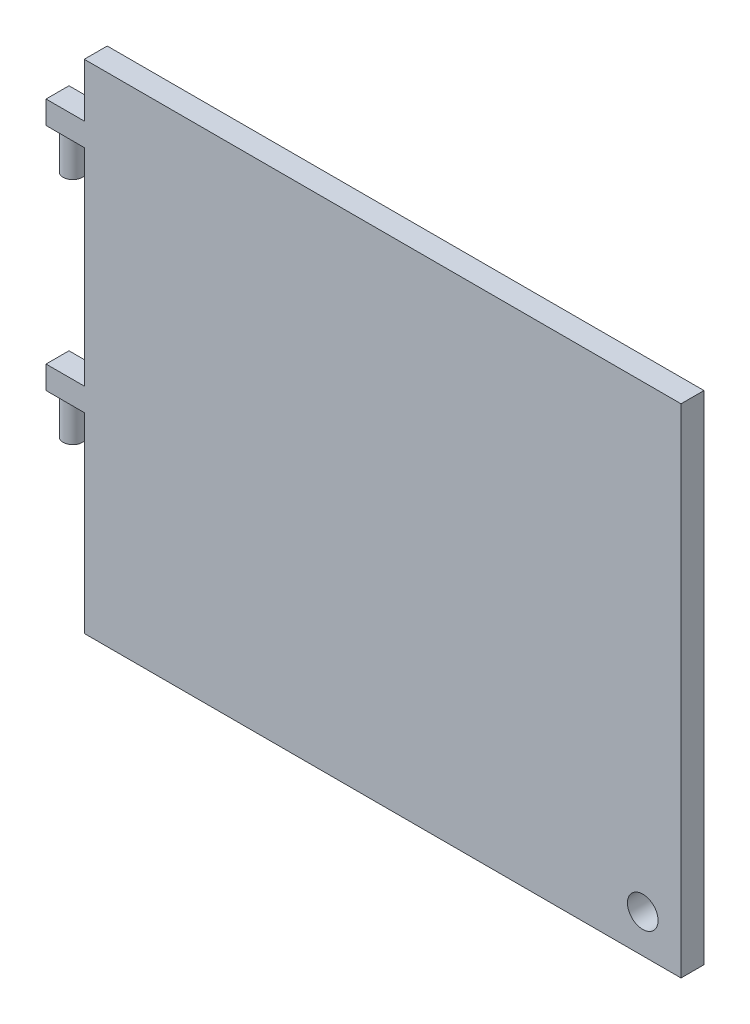
ISO-10303-21;
HEADER;
FILE_DESCRIPTION(('STEP AP214'),'2;1');
FILE_NAME('part.step','',(''),(''),'','','');
FILE_SCHEMA(('AUTOMOTIVE_DESIGN { 1 0 10303 214 1 1 1 1 }'));
ENDSEC;
DATA;
#1=APPLICATION_CONTEXT('core data for automotive mechanical design processes');
#2=APPLICATION_PROTOCOL_DEFINITION('international standard','automotive_design',2000,#1);
#3=PRODUCT_CONTEXT('',#1,'mechanical');
#4=PRODUCT('Part','Part','',(#3));
#5=PRODUCT_RELATED_PRODUCT_CATEGORY('part','',(#4));
#6=PRODUCT_DEFINITION_FORMATION('','',#4);
#7=PRODUCT_DEFINITION_CONTEXT('part definition',#1,'design');
#8=PRODUCT_DEFINITION('design','',#6,#7);
#9=PRODUCT_DEFINITION_SHAPE('','',#8);
#10=(LENGTH_UNIT() NAMED_UNIT(*) SI_UNIT(.MILLI.,.METRE.));
#11=(NAMED_UNIT(*) PLANE_ANGLE_UNIT() SI_UNIT($,.RADIAN.));
#12=(NAMED_UNIT(*) SI_UNIT($,.STERADIAN.) SOLID_ANGLE_UNIT());
#13=UNCERTAINTY_MEASURE_WITH_UNIT(LENGTH_MEASURE(1.E-05),#10,'distance_accuracy_value','');
#14=(GEOMETRIC_REPRESENTATION_CONTEXT(3) GLOBAL_UNCERTAINTY_ASSIGNED_CONTEXT((#13)) GLOBAL_UNIT_ASSIGNED_CONTEXT((#10,
#11,#12)) REPRESENTATION_CONTEXT('',''));
#15=CARTESIAN_POINT('',(0.,0.,0.));
#16=DIRECTION('',(0.,0.,1.));
#17=DIRECTION('',(1.,0.,0.));
#18=AXIS2_PLACEMENT_3D('',#15,#16,#17);
#19=CARTESIAN_POINT('',(0.,0.,3.));
#20=DIRECTION('',(1.,0.,0.));
#21=DIRECTION('',(0.,0.,-1.));
#22=AXIS2_PLACEMENT_3D('',#19,#20,#21);
#23=PLANE('',#22);
#24=DIRECTION('',(0.,0.,1.));
#25=VECTOR('',#24,1.);
#26=CARTESIAN_POINT('',(0.,25.,3.));
#27=LINE('',#26,#25);
#28=CARTESIAN_POINT('',(0.,25.,0.));
#29=VERTEX_POINT('',#28);
#30=CARTESIAN_POINT('',(0.,25.,3.));
#31=VERTEX_POINT('',#30);
#32=EDGE_CURVE('E144',#29,#31,#27,.T.);
#33=ORIENTED_EDGE('',*,*,#32,.F.);
#34=DIRECTION('',(0.,-1.,0.));
#35=VECTOR('',#34,1.);
#36=CARTESIAN_POINT('',(0.,0.,0.));
#37=LINE('',#36,#35);
#38=CARTESIAN_POINT('',(0.,0.,0.));
#39=VERTEX_POINT('',#38);
#40=EDGE_CURVE('E132',#29,#39,#37,.T.);
#41=ORIENTED_EDGE('',*,*,#40,.T.);
#42=DIRECTION('',(0.,0.,-1.));
#43=VECTOR('',#42,1.);
#44=CARTESIAN_POINT('',(0.,0.,3.));
#45=LINE('',#44,#43);
#46=CARTESIAN_POINT('',(0.,0.,3.));
#47=VERTEX_POINT('',#46);
#48=EDGE_CURVE('E212',#47,#39,#45,.T.);
#49=ORIENTED_EDGE('',*,*,#48,.F.);
#50=DIRECTION('',(0.,-1.,0.));
#51=VECTOR('',#50,1.);
#52=CARTESIAN_POINT('',(0.,0.,3.));
#53=LINE('',#52,#51);
#54=EDGE_CURVE('E57',#31,#47,#53,.T.);
#55=ORIENTED_EDGE('',*,*,#54,.F.);
#56=EDGE_LOOP('',(#33,#41,#49,#55));
#57=FACE_BOUND('',#56,.T.);
#58=ADVANCED_FACE('F41',(#57),#23,.F.);
#59=DIRECTION('',(0.,0.,-1.));
#60=VECTOR('',#59,1.);
#61=CARTESIAN_POINT('',(0.,28.,0.));
#62=LINE('',#61,#60);
#63=CARTESIAN_POINT('',(0.,28.,3.));
#64=VERTEX_POINT('',#63);
#65=CARTESIAN_POINT('',(0.,28.,0.));
#66=VERTEX_POINT('',#65);
#67=EDGE_CURVE('E65',#64,#66,#62,.T.);
#68=ORIENTED_EDGE('',*,*,#67,.F.);
#69=CARTESIAN_POINT('',(0.,55.,3.));
#70=VERTEX_POINT('',#69);
#71=EDGE_CURVE('E213',#70,#64,#53,.T.);
#72=ORIENTED_EDGE('',*,*,#71,.F.);
#73=DIRECTION('',(0.,0.,1.));
#74=VECTOR('',#73,1.);
#75=CARTESIAN_POINT('',(0.,55.,3.));
#76=LINE('',#75,#74);
#77=CARTESIAN_POINT('',(0.,55.,0.));
#78=VERTEX_POINT('',#77);
#79=EDGE_CURVE('E148',#78,#70,#76,.T.);
#80=ORIENTED_EDGE('',*,*,#79,.F.);
#81=EDGE_CURVE('E140',#78,#66,#37,.T.);
#82=ORIENTED_EDGE('',*,*,#81,.T.);
#83=EDGE_LOOP('',(#68,#72,#80,#82));
#84=FACE_BOUND('',#83,.T.);
#85=ADVANCED_FACE('F252',(#84),#23,.F.);
#86=DIRECTION('',(0.,0.,-1.));
#87=VECTOR('',#86,1.);
#88=CARTESIAN_POINT('',(0.,58.,0.));
#89=LINE('',#88,#87);
#90=CARTESIAN_POINT('',(0.,58.,3.));
#91=VERTEX_POINT('',#90);
#92=CARTESIAN_POINT('',(0.,58.,0.));
#93=VERTEX_POINT('',#92);
#94=EDGE_CURVE('E180',#91,#93,#89,.T.);
#95=ORIENTED_EDGE('',*,*,#94,.F.);
#96=CARTESIAN_POINT('',(0.,65.,3.));
#97=VERTEX_POINT('',#96);
#98=EDGE_CURVE('E209',#97,#91,#53,.T.);
#99=ORIENTED_EDGE('',*,*,#98,.F.);
#100=DIRECTION('',(0.,0.,-1.));
#101=VECTOR('',#100,1.);
#102=CARTESIAN_POINT('',(0.,65.,3.));
#103=LINE('',#102,#101);
#104=CARTESIAN_POINT('',(0.,65.,0.));
#105=VERTEX_POINT('',#104);
#106=EDGE_CURVE('E219',#97,#105,#103,.T.);
#107=ORIENTED_EDGE('',*,*,#106,.T.);
#108=EDGE_CURVE('E143',#105,#93,#37,.T.);
#109=ORIENTED_EDGE('',*,*,#108,.T.);
#110=EDGE_LOOP('',(#95,#99,#107,#109));
#111=FACE_BOUND('',#110,.T.);
#112=ADVANCED_FACE('F272',(#111),#23,.F.);
#113=CARTESIAN_POINT('',(78.,0.,3.));
#114=DIRECTION('',(0.,1.,0.));
#115=DIRECTION('',(0.,0.,1.));
#116=AXIS2_PLACEMENT_3D('',#113,#114,#115);
#117=PLANE('',#116);
#118=DIRECTION('',(1.,0.,0.));
#119=VECTOR('',#118,1.);
#120=CARTESIAN_POINT('',(78.,0.,0.));
#121=LINE('',#120,#119);
#122=CARTESIAN_POINT('',(78.,0.,0.));
#123=VERTEX_POINT('',#122);
#124=EDGE_CURVE('E138',#39,#123,#121,.T.);
#125=ORIENTED_EDGE('',*,*,#124,.T.);
#126=DIRECTION('',(0.,0.,-1.));
#127=VECTOR('',#126,1.);
#128=CARTESIAN_POINT('',(78.,0.,3.));
#129=LINE('',#128,#127);
#130=CARTESIAN_POINT('',(78.,0.,3.));
#131=VERTEX_POINT('',#130);
#132=EDGE_CURVE('E225',#131,#123,#129,.T.);
#133=ORIENTED_EDGE('',*,*,#132,.F.);
#134=DIRECTION('',(1.,0.,0.));
#135=VECTOR('',#134,1.);
#136=CARTESIAN_POINT('',(78.,0.,3.));
#137=LINE('',#136,#135);
#138=EDGE_CURVE('E202',#47,#131,#137,.T.);
#139=ORIENTED_EDGE('',*,*,#138,.F.);
#140=ORIENTED_EDGE('',*,*,#48,.T.);
#141=EDGE_LOOP('',(#125,#133,#139,#140));
#142=FACE_BOUND('',#141,.T.);
#143=ADVANCED_FACE('F43',(#142),#117,.F.);
#144=CARTESIAN_POINT('',(78.,65.,3.));
#145=DIRECTION('',(-1.,0.,0.));
#146=DIRECTION('',(0.,0.,1.));
#147=AXIS2_PLACEMENT_3D('',#144,#145,#146);
#148=PLANE('',#147);
#149=DIRECTION('',(0.,1.,0.));
#150=VECTOR('',#149,1.);
#151=CARTESIAN_POINT('',(78.,65.,0.));
#152=LINE('',#151,#150);
#153=CARTESIAN_POINT('',(78.,65.,0.));
#154=VERTEX_POINT('',#153);
#155=EDGE_CURVE('E215',#123,#154,#152,.T.);
#156=ORIENTED_EDGE('',*,*,#155,.T.);
#157=DIRECTION('',(0.,0.,-1.));
#158=VECTOR('',#157,1.);
#159=CARTESIAN_POINT('',(78.,65.,3.));
#160=LINE('',#159,#158);
#161=CARTESIAN_POINT('',(78.,65.,3.));
#162=VERTEX_POINT('',#161);
#163=EDGE_CURVE('E222',#162,#154,#160,.T.);
#164=ORIENTED_EDGE('',*,*,#163,.F.);
#165=DIRECTION('',(0.,1.,0.));
#166=VECTOR('',#165,1.);
#167=CARTESIAN_POINT('',(78.,65.,3.));
#168=LINE('',#167,#166);
#169=EDGE_CURVE('E205',#131,#162,#168,.T.);
#170=ORIENTED_EDGE('',*,*,#169,.F.);
#171=ORIENTED_EDGE('',*,*,#132,.T.);
#172=EDGE_LOOP('',(#156,#164,#170,#171));
#173=FACE_BOUND('',#172,.T.);
#174=ADVANCED_FACE('F285',(#173),#148,.F.);
#175=CARTESIAN_POINT('',(0.,65.,3.));
#176=DIRECTION('',(0.,-1.,0.));
#177=DIRECTION('',(0.,0.,-1.));
#178=AXIS2_PLACEMENT_3D('',#175,#176,#177);
#179=PLANE('',#178);
#180=DIRECTION('',(-1.,0.,0.));
#181=VECTOR('',#180,1.);
#182=CARTESIAN_POINT('',(0.,65.,0.));
#183=LINE('',#182,#181);
#184=EDGE_CURVE('E141',#154,#105,#183,.T.);
#185=ORIENTED_EDGE('',*,*,#184,.T.);
#186=ORIENTED_EDGE('',*,*,#106,.F.);
#187=DIRECTION('',(-1.,0.,0.));
#188=VECTOR('',#187,1.);
#189=CARTESIAN_POINT('',(0.,65.,3.));
#190=LINE('',#189,#188);
#191=EDGE_CURVE('E207',#162,#97,#190,.T.);
#192=ORIENTED_EDGE('',*,*,#191,.F.);
#193=ORIENTED_EDGE('',*,*,#163,.T.);
#194=EDGE_LOOP('',(#185,#186,#192,#193));
#195=FACE_BOUND('',#194,.T.);
#196=ADVANCED_FACE('F294',(#195),#179,.F.);
#197=CARTESIAN_POINT('',(0.,0.,3.));
#198=DIRECTION('',(0.,0.,-1.));
#199=DIRECTION('',(-1.,0.,0.));
#200=AXIS2_PLACEMENT_3D('',#197,#198,#199);
#201=PLANE('',#200);
#202=CARTESIAN_POINT('',(73.,5.,3.));
#203=DIRECTION('',(0.,0.,1.));
#204=DIRECTION('',(1.,0.,0.));
#205=AXIS2_PLACEMENT_3D('',#202,#203,#204);
#206=CIRCLE('',#205,2.);
#207=CARTESIAN_POINT('',(75.,5.,3.));
#208=VERTEX_POINT('',#207);
#209=EDGE_CURVE('E343',#208,#208,#206,.T.);
#210=ORIENTED_EDGE('',*,*,#209,.F.);
#211=EDGE_LOOP('',(#210));
#212=FACE_BOUND('',#211,.T.);
#213=ORIENTED_EDGE('',*,*,#138,.T.);
#214=ORIENTED_EDGE('',*,*,#169,.T.);
#215=ORIENTED_EDGE('',*,*,#191,.T.);
#216=ORIENTED_EDGE('',*,*,#98,.T.);
#217=DIRECTION('',(1.,0.,0.));
#218=VECTOR('',#217,1.);
#219=CARTESIAN_POINT('',(-5.,58.,3.));
#220=LINE('',#219,#218);
#221=CARTESIAN_POINT('',(-5.,58.,3.));
#222=VERTEX_POINT('',#221);
#223=EDGE_CURVE('E193',#222,#91,#220,.T.);
#224=ORIENTED_EDGE('',*,*,#223,.F.);
#225=DIRECTION('',(0.,1.,0.));
#226=VECTOR('',#225,1.);
#227=CARTESIAN_POINT('',(-5.,58.,3.));
#228=LINE('',#227,#226);
#229=CARTESIAN_POINT('',(-5.,55.,3.));
#230=VERTEX_POINT('',#229);
#231=EDGE_CURVE('E182',#230,#222,#228,.T.);
#232=ORIENTED_EDGE('',*,*,#231,.F.);
#233=DIRECTION('',(1.,0.,0.));
#234=VECTOR('',#233,1.);
#235=CARTESIAN_POINT('',(-5.,55.,3.));
#236=LINE('',#235,#234);
#237=EDGE_CURVE('E196',#230,#70,#236,.T.);
#238=ORIENTED_EDGE('',*,*,#237,.T.);
#239=ORIENTED_EDGE('',*,*,#71,.T.);
#240=DIRECTION('',(1.,0.,0.));
#241=VECTOR('',#240,1.);
#242=CARTESIAN_POINT('',(-5.,28.,3.));
#243=LINE('',#242,#241);
#244=CARTESIAN_POINT('',(-5.,28.,3.));
#245=VERTEX_POINT('',#244);
#246=EDGE_CURVE('E156',#245,#64,#243,.T.);
#247=ORIENTED_EDGE('',*,*,#246,.F.);
#248=DIRECTION('',(0.,1.,0.));
#249=VECTOR('',#248,1.);
#250=CARTESIAN_POINT('',(-5.,28.,3.));
#251=LINE('',#250,#249);
#252=CARTESIAN_POINT('',(-5.,25.,3.));
#253=VERTEX_POINT('',#252);
#254=EDGE_CURVE('E172',#253,#245,#251,.T.);
#255=ORIENTED_EDGE('',*,*,#254,.F.);
#256=DIRECTION('',(1.,0.,0.));
#257=VECTOR('',#256,1.);
#258=CARTESIAN_POINT('',(-5.,25.,3.));
#259=LINE('',#258,#257);
#260=EDGE_CURVE('E153',#253,#31,#259,.T.);
#261=ORIENTED_EDGE('',*,*,#260,.T.);
#262=ORIENTED_EDGE('',*,*,#54,.T.);
#263=EDGE_LOOP('',(#213,#214,#215,#216,#224,#232,#238,#239,#247,#255,#261,#262));
#264=FACE_BOUND('',#263,.T.);
#265=ADVANCED_FACE('F243',(#212,#264),#201,.F.);
#266=CARTESIAN_POINT('',(0.,0.,0.));
#267=DIRECTION('',(0.,0.,-1.));
#268=DIRECTION('',(-1.,0.,0.));
#269=AXIS2_PLACEMENT_3D('',#266,#267,#268);
#270=PLANE('',#269);
#271=CARTESIAN_POINT('',(73.,5.,0.));
#272=DIRECTION('',(0.,0.,-1.));
#273=DIRECTION('',(-1.,0.,0.));
#274=AXIS2_PLACEMENT_3D('',#271,#272,#273);
#275=CIRCLE('',#274,2.);
#276=CARTESIAN_POINT('',(71.,5.,0.));
#277=VERTEX_POINT('',#276);
#278=EDGE_CURVE('E45',#277,#277,#275,.T.);
#279=ORIENTED_EDGE('',*,*,#278,.F.);
#280=EDGE_LOOP('',(#279));
#281=FACE_BOUND('',#280,.T.);
#282=ORIENTED_EDGE('',*,*,#124,.F.);
#283=ORIENTED_EDGE('',*,*,#40,.F.);
#284=DIRECTION('',(1.,0.,0.));
#285=VECTOR('',#284,1.);
#286=CARTESIAN_POINT('',(-5.,25.,0.));
#287=LINE('',#286,#285);
#288=CARTESIAN_POINT('',(-5.,25.,0.));
#289=VERTEX_POINT('',#288);
#290=EDGE_CURVE('E136',#289,#29,#287,.T.);
#291=ORIENTED_EDGE('',*,*,#290,.F.);
#292=DIRECTION('',(0.,-1.,0.));
#293=VECTOR('',#292,1.);
#294=CARTESIAN_POINT('',(-5.,25.,0.));
#295=LINE('',#294,#293);
#296=CARTESIAN_POINT('',(-5.,28.,0.));
#297=VERTEX_POINT('',#296);
#298=EDGE_CURVE('E169',#297,#289,#295,.T.);
#299=ORIENTED_EDGE('',*,*,#298,.F.);
#300=DIRECTION('',(1.,0.,0.));
#301=VECTOR('',#300,1.);
#302=CARTESIAN_POINT('',(-5.,28.,0.));
#303=LINE('',#302,#301);
#304=EDGE_CURVE('E165',#297,#66,#303,.T.);
#305=ORIENTED_EDGE('',*,*,#304,.T.);
#306=ORIENTED_EDGE('',*,*,#81,.F.);
#307=DIRECTION('',(1.,0.,0.));
#308=VECTOR('',#307,1.);
#309=CARTESIAN_POINT('',(-5.,55.,0.));
#310=LINE('',#309,#308);
#311=CARTESIAN_POINT('',(-5.,55.,0.));
#312=VERTEX_POINT('',#311);
#313=EDGE_CURVE('E199',#312,#78,#310,.T.);
#314=ORIENTED_EDGE('',*,*,#313,.F.);
#315=DIRECTION('',(0.,-1.,0.));
#316=VECTOR('',#315,1.);
#317=CARTESIAN_POINT('',(-5.,55.,0.));
#318=LINE('',#317,#316);
#319=CARTESIAN_POINT('',(-5.,58.,0.));
#320=VERTEX_POINT('',#319);
#321=EDGE_CURVE('E176',#320,#312,#318,.T.);
#322=ORIENTED_EDGE('',*,*,#321,.F.);
#323=DIRECTION('',(1.,0.,0.));
#324=VECTOR('',#323,1.);
#325=CARTESIAN_POINT('',(-5.,58.,0.));
#326=LINE('',#325,#324);
#327=EDGE_CURVE('E186',#320,#93,#326,.T.);
#328=ORIENTED_EDGE('',*,*,#327,.T.);
#329=ORIENTED_EDGE('',*,*,#108,.F.);
#330=ORIENTED_EDGE('',*,*,#184,.F.);
#331=ORIENTED_EDGE('',*,*,#155,.F.);
#332=EDGE_LOOP('',(#282,#283,#291,#299,#305,#306,#314,#322,#328,#329,#330,#331));
#333=FACE_BOUND('',#332,.T.);
#334=ADVANCED_FACE('F133',(#281,#333),#270,.T.);
#335=CARTESIAN_POINT('',(-5.,55.,3.));
#336=DIRECTION('',(0.,1.,0.));
#337=DIRECTION('',(0.,0.,1.));
#338=AXIS2_PLACEMENT_3D('',#335,#336,#337);
#339=PLANE('',#338);
#340=CARTESIAN_POINT('',(-3.,55.,1.5));
#341=DIRECTION('',(0.,1.,0.));
#342=DIRECTION('',(0.,0.,1.));
#343=AXIS2_PLACEMENT_3D('',#340,#341,#342);
#344=CIRCLE('',#343,1.25);
#345=CARTESIAN_POINT('',(-3.,55.,2.75));
#346=VERTEX_POINT('',#345);
#347=EDGE_CURVE('E50',#346,#346,#344,.F.);
#348=ORIENTED_EDGE('',*,*,#347,.F.);
#349=EDGE_LOOP('',(#348));
#350=FACE_BOUND('',#349,.T.);
#351=ORIENTED_EDGE('',*,*,#79,.T.);
#352=ORIENTED_EDGE('',*,*,#237,.F.);
#353=DIRECTION('',(0.,0.,1.));
#354=VECTOR('',#353,1.);
#355=CARTESIAN_POINT('',(-5.,55.,3.));
#356=LINE('',#355,#354);
#357=EDGE_CURVE('E179',#312,#230,#356,.T.);
#358=ORIENTED_EDGE('',*,*,#357,.F.);
#359=ORIENTED_EDGE('',*,*,#313,.T.);
#360=EDGE_LOOP('',(#351,#352,#358,#359));
#361=FACE_BOUND('',#360,.T.);
#362=ADVANCED_FACE('F233',(#350,#361),#339,.F.);
#363=CARTESIAN_POINT('',(-5.,58.,0.));
#364=DIRECTION('',(0.,-1.,0.));
#365=DIRECTION('',(0.,0.,-1.));
#366=AXIS2_PLACEMENT_3D('',#363,#364,#365);
#367=PLANE('',#366);
#368=ORIENTED_EDGE('',*,*,#94,.T.);
#369=ORIENTED_EDGE('',*,*,#327,.F.);
#370=DIRECTION('',(0.,0.,-1.));
#371=VECTOR('',#370,1.);
#372=CARTESIAN_POINT('',(-5.,58.,0.));
#373=LINE('',#372,#371);
#374=EDGE_CURVE('E184',#222,#320,#373,.T.);
#375=ORIENTED_EDGE('',*,*,#374,.F.);
#376=ORIENTED_EDGE('',*,*,#223,.T.);
#377=EDGE_LOOP('',(#368,#369,#375,#376));
#378=FACE_BOUND('',#377,.T.);
#379=ADVANCED_FACE('F236',(#378),#367,.F.);
#380=CARTESIAN_POINT('',(-5.,0.,0.));
#381=DIRECTION('',(1.,0.,0.));
#382=DIRECTION('',(0.,0.,-1.));
#383=AXIS2_PLACEMENT_3D('',#380,#381,#382);
#384=PLANE('',#383);
#385=ORIENTED_EDGE('',*,*,#321,.T.);
#386=ORIENTED_EDGE('',*,*,#357,.T.);
#387=ORIENTED_EDGE('',*,*,#231,.T.);
#388=ORIENTED_EDGE('',*,*,#374,.T.);
#389=EDGE_LOOP('',(#385,#386,#387,#388));
#390=FACE_BOUND('',#389,.T.);
#391=ADVANCED_FACE('F248',(#390),#384,.F.);
#392=CARTESIAN_POINT('',(-5.,25.,3.));
#393=DIRECTION('',(0.,1.,0.));
#394=DIRECTION('',(0.,0.,1.));
#395=AXIS2_PLACEMENT_3D('',#392,#393,#394);
#396=PLANE('',#395);
#397=CARTESIAN_POINT('',(-3.,25.,1.5));
#398=DIRECTION('',(0.,1.,0.));
#399=DIRECTION('',(0.,0.,1.));
#400=AXIS2_PLACEMENT_3D('',#397,#398,#399);
#401=CIRCLE('',#400,1.25);
#402=CARTESIAN_POINT('',(-3.,25.,2.75));
#403=VERTEX_POINT('',#402);
#404=EDGE_CURVE('E11',#403,#403,#401,.F.);
#405=ORIENTED_EDGE('',*,*,#404,.F.);
#406=EDGE_LOOP('',(#405));
#407=FACE_BOUND('',#406,.T.);
#408=ORIENTED_EDGE('',*,*,#32,.T.);
#409=ORIENTED_EDGE('',*,*,#260,.F.);
#410=DIRECTION('',(0.,0.,1.));
#411=VECTOR('',#410,1.);
#412=CARTESIAN_POINT('',(-5.,25.,3.));
#413=LINE('',#412,#411);
#414=EDGE_CURVE('E151',#289,#253,#413,.T.);
#415=ORIENTED_EDGE('',*,*,#414,.F.);
#416=ORIENTED_EDGE('',*,*,#290,.T.);
#417=EDGE_LOOP('',(#408,#409,#415,#416));
#418=FACE_BOUND('',#417,.T.);
#419=ADVANCED_FACE('F150',(#407,#418),#396,.F.);
#420=CARTESIAN_POINT('',(-5.,28.,0.));
#421=DIRECTION('',(0.,-1.,0.));
#422=DIRECTION('',(0.,0.,-1.));
#423=AXIS2_PLACEMENT_3D('',#420,#421,#422);
#424=PLANE('',#423);
#425=ORIENTED_EDGE('',*,*,#67,.T.);
#426=ORIENTED_EDGE('',*,*,#304,.F.);
#427=DIRECTION('',(0.,0.,-1.));
#428=VECTOR('',#427,1.);
#429=CARTESIAN_POINT('',(-5.,28.,0.));
#430=LINE('',#429,#428);
#431=EDGE_CURVE('E168',#245,#297,#430,.T.);
#432=ORIENTED_EDGE('',*,*,#431,.F.);
#433=ORIENTED_EDGE('',*,*,#246,.T.);
#434=EDGE_LOOP('',(#425,#426,#432,#433));
#435=FACE_BOUND('',#434,.T.);
#436=ADVANCED_FACE('F254',(#435),#424,.F.);
#437=CARTESIAN_POINT('',(-5.,0.,0.));
#438=DIRECTION('',(1.,0.,0.));
#439=DIRECTION('',(0.,0.,-1.));
#440=AXIS2_PLACEMENT_3D('',#437,#438,#439);
#441=PLANE('',#440);
#442=ORIENTED_EDGE('',*,*,#298,.T.);
#443=ORIENTED_EDGE('',*,*,#414,.T.);
#444=ORIENTED_EDGE('',*,*,#254,.T.);
#445=ORIENTED_EDGE('',*,*,#431,.T.);
#446=EDGE_LOOP('',(#442,#443,#444,#445));
#447=FACE_BOUND('',#446,.T.);
#448=ADVANCED_FACE('F258',(#447),#441,.F.);
#449=CARTESIAN_POINT('',(-3.,50.,1.5));
#450=DIRECTION('',(0.,1.,0.));
#451=DIRECTION('',(0.,0.,1.));
#452=AXIS2_PLACEMENT_3D('',#449,#450,#451);
#453=CYLINDRICAL_SURFACE('',#452,1.25);
#454=CARTESIAN_POINT('',(-3.,50.,1.5));
#455=DIRECTION('',(0.,-1.,0.));
#456=DIRECTION('',(0.,0.,-1.));
#457=AXIS2_PLACEMENT_3D('',#454,#455,#456);
#458=CIRCLE('',#457,1.25);
#459=CARTESIAN_POINT('',(-3.,50.,0.25));
#460=VERTEX_POINT('',#459);
#461=EDGE_CURVE('E154',#460,#460,#458,.T.);
#462=ORIENTED_EDGE('',*,*,#461,.F.);
#463=EDGE_LOOP('',(#462));
#464=FACE_BOUND('',#463,.T.);
#465=ORIENTED_EDGE('',*,*,#347,.T.);
#466=EDGE_LOOP('',(#465));
#467=FACE_BOUND('',#466,.T.);
#468=ADVANCED_FACE('F231',(#464,#467),#453,.T.);
#469=CARTESIAN_POINT('',(-3.,50.,1.5));
#470=DIRECTION('',(0.,-1.,0.));
#471=DIRECTION('',(0.,0.,-1.));
#472=AXIS2_PLACEMENT_3D('',#469,#470,#471);
#473=PLANE('',#472);
#474=ORIENTED_EDGE('',*,*,#461,.T.);
#475=EDGE_LOOP('',(#474));
#476=FACE_BOUND('',#475,.T.);
#477=ADVANCED_FACE('F265',(#476),#473,.T.);
#478=CARTESIAN_POINT('',(-3.,20.,1.49999999999999));
#479=DIRECTION('',(0.,1.,0.));
#480=DIRECTION('',(0.,0.,1.));
#481=AXIS2_PLACEMENT_3D('',#478,#479,#480);
#482=CYLINDRICAL_SURFACE('',#481,1.25);
#483=CARTESIAN_POINT('',(-3.,20.,1.49999999999999));
#484=DIRECTION('',(0.,-1.,0.));
#485=DIRECTION('',(0.,0.,-1.));
#486=AXIS2_PLACEMENT_3D('',#483,#484,#485);
#487=CIRCLE('',#486,1.25);
#488=CARTESIAN_POINT('',(-3.,20.,0.249999999999994));
#489=VERTEX_POINT('',#488);
#490=EDGE_CURVE('E159',#489,#489,#487,.T.);
#491=ORIENTED_EDGE('',*,*,#490,.F.);
#492=EDGE_LOOP('',(#491));
#493=FACE_BOUND('',#492,.T.);
#494=ORIENTED_EDGE('',*,*,#404,.T.);
#495=EDGE_LOOP('',(#494));
#496=FACE_BOUND('',#495,.T.);
#497=ADVANCED_FACE('F327',(#493,#496),#482,.T.);
#498=CARTESIAN_POINT('',(-3.,20.,1.49999999999999));
#499=DIRECTION('',(0.,-1.,0.));
#500=DIRECTION('',(0.,0.,-1.));
#501=AXIS2_PLACEMENT_3D('',#498,#499,#500);
#502=PLANE('',#501);
#503=ORIENTED_EDGE('',*,*,#490,.T.);
#504=EDGE_LOOP('',(#503));
#505=FACE_BOUND('',#504,.T.);
#506=ADVANCED_FACE('F330',(#505),#502,.T.);
#507=CARTESIAN_POINT('',(73.,5.,-7.));
#508=DIRECTION('',(0.,0.,1.));
#509=DIRECTION('',(1.,0.,0.));
#510=AXIS2_PLACEMENT_3D('',#507,#508,#509);
#511=CYLINDRICAL_SURFACE('',#510,2.);
#512=ORIENTED_EDGE('',*,*,#278,.T.);
#513=EDGE_LOOP('',(#512));
#514=FACE_BOUND('',#513,.T.);
#515=ORIENTED_EDGE('',*,*,#209,.T.);
#516=EDGE_LOOP('',(#515));
#517=FACE_BOUND('',#516,.T.);
#518=ADVANCED_FACE('F333',(#514,#517),#511,.F.);
#519=CLOSED_SHELL('',(#58,#85,#112,#143,#174,#196,#265,#334,#362,#379,#391,#419,#436,#448,#468,
#477,#497,#506,#518));
#520=MANIFOLD_SOLID_BREP('B2',#519);
#521=ADVANCED_BREP_SHAPE_REPRESENTATION('',(#18,#520),#14);
#522=SHAPE_DEFINITION_REPRESENTATION(#9,#521);
ENDSEC;
END-ISO-10303-21;
